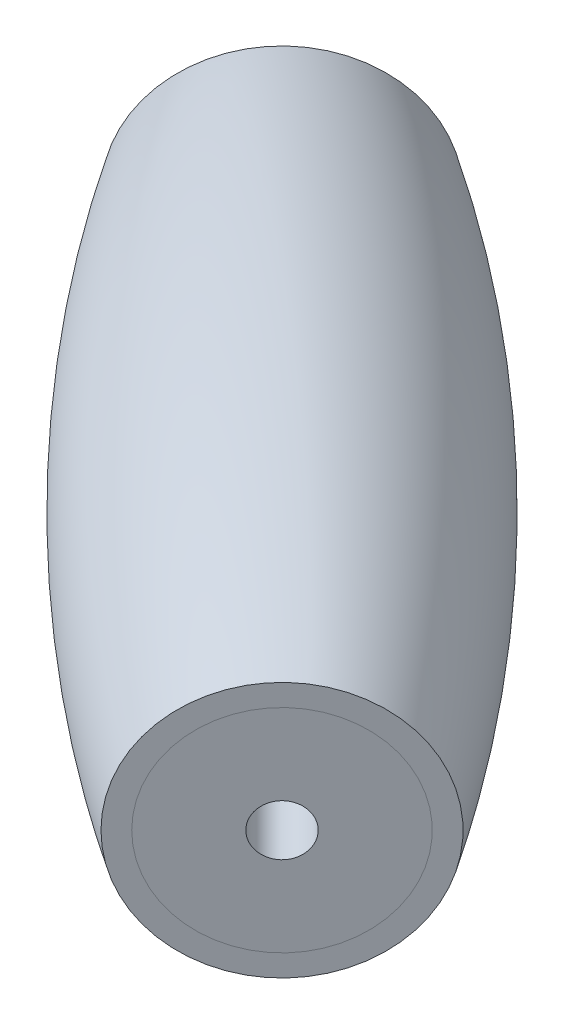
ISO-10303-21;
HEADER;
FILE_DESCRIPTION(('STEP AP214'),'2;1');
FILE_NAME('part.step','',(''),(''),'','','');
FILE_SCHEMA(('AUTOMOTIVE_DESIGN { 1 0 10303 214 1 1 1 1 }'));
ENDSEC;
DATA;
#1=APPLICATION_CONTEXT('core data for automotive mechanical design processes');
#2=APPLICATION_PROTOCOL_DEFINITION('international standard','automotive_design',2000,#1);
#3=PRODUCT_CONTEXT('',#1,'mechanical');
#4=PRODUCT('Part','Part','',(#3));
#5=PRODUCT_RELATED_PRODUCT_CATEGORY('part','',(#4));
#6=PRODUCT_DEFINITION_FORMATION('','',#4);
#7=PRODUCT_DEFINITION_CONTEXT('part definition',#1,'design');
#8=PRODUCT_DEFINITION('design','',#6,#7);
#9=PRODUCT_DEFINITION_SHAPE('','',#8);
#10=(LENGTH_UNIT() NAMED_UNIT(*) SI_UNIT(.MILLI.,.METRE.));
#11=(NAMED_UNIT(*) PLANE_ANGLE_UNIT() SI_UNIT($,.RADIAN.));
#12=(NAMED_UNIT(*) SI_UNIT($,.STERADIAN.) SOLID_ANGLE_UNIT());
#13=UNCERTAINTY_MEASURE_WITH_UNIT(LENGTH_MEASURE(1.E-05),#10,'distance_accuracy_value','');
#14=(GEOMETRIC_REPRESENTATION_CONTEXT(3) GLOBAL_UNCERTAINTY_ASSIGNED_CONTEXT((#13)) GLOBAL_UNIT_ASSIGNED_CONTEXT((#10,
#11,#12)) REPRESENTATION_CONTEXT('',''));
#15=CARTESIAN_POINT('',(0.,0.,0.));
#16=DIRECTION('',(0.,0.,1.));
#17=DIRECTION('',(1.,0.,0.));
#18=AXIS2_PLACEMENT_3D('',#15,#16,#17);
#19=CARTESIAN_POINT('',(0.,21.1042452771327,0.));
#20=DIRECTION('',(-0.707106781186546,0.,-0.707106781186549));
#21=DIRECTION('',(-0.707106781186549,0.,0.707106781186546));
#22=AXIS2_PLACEMENT_3D('',#19,#20,#21);
#23=DEGENERATE_TOROIDAL_SURFACE('',#22,43.1042452771327,46.5,.F.);
#24=CARTESIAN_POINT('',(6.4574982549739,21.1042452771328,6.45749825497393));
#25=DIRECTION('',(-0.707106781186546,0.,-0.707106781186549));
#26=DIRECTION('',(-0.707106781186549,0.,0.707106781186546));
#27=AXIS2_PLACEMENT_3D('',#24,#25,#26);
#28=CIRCLE('',#27,2.49017798464365);
#29=CARTESIAN_POINT('',(4.69667651567093,21.1042452771328,8.2183199942769));
#30=VERTEX_POINT('',#29);
#31=EDGE_CURVE('E11',#30,#30,#28,.T.);
#32=ORIENTED_EDGE('',*,*,#31,.F.);
#33=EDGE_LOOP('',(#32));
#34=FACE_BOUND('',#33,.T.);
#35=CARTESIAN_POINT('',(-6.45749825497391,21.1042452771327,-6.45749825497393));
#36=DIRECTION('',(-0.707106781186546,0.,-0.707106781186549));
#37=DIRECTION('',(-0.707106781186549,0.,0.707106781186546));
#38=AXIS2_PLACEMENT_3D('',#35,#36,#37);
#39=CIRCLE('',#38,2.49017798464364);
#40=CARTESIAN_POINT('',(-8.21831999427688,21.1042452771327,-4.69667651567096));
#41=VERTEX_POINT('',#40);
#42=EDGE_CURVE('E52',#41,#41,#39,.T.);
#43=ORIENTED_EDGE('',*,*,#42,.T.);
#44=EDGE_LOOP('',(#43));
#45=FACE_BOUND('',#44,.T.);
#46=ADVANCED_FACE('F38',(#34,#45),#23,.T.);
#47=CARTESIAN_POINT('',(6.4574982549739,23.5944232617764,6.45749825497392));
#48=DIRECTION('',(-0.707106781186546,0.,-0.707106781186549));
#49=DIRECTION('',(-0.707106781186549,0.,0.707106781186546));
#50=AXIS2_PLACEMENT_3D('',#47,#48,#49);
#51=PLANE('',#50);
#52=CARTESIAN_POINT('',(6.45749825497388,21.1042452771328,6.45749825497391));
#53=DIRECTION('',(-0.707106781186546,0.,-0.707106781186549));
#54=DIRECTION('',(-0.707106781186549,0.,0.707106781186546));
#55=AXIS2_PLACEMENT_3D('',#52,#53,#54);
#56=CIRCLE('',#55,3.);
#57=CARTESIAN_POINT('',(4.33617791141424,21.1042452771328,8.57881859853355));
#58=VERTEX_POINT('',#57);
#59=EDGE_CURVE('E44',#58,#58,#56,.T.);
#60=ORIENTED_EDGE('',*,*,#59,.F.);
#61=EDGE_LOOP('',(#60));
#62=FACE_BOUND('',#61,.T.);
#63=ORIENTED_EDGE('',*,*,#31,.T.);
#64=EDGE_LOOP('',(#63));
#65=FACE_BOUND('',#64,.T.);
#66=ADVANCED_FACE('F67',(#62,#65),#51,.F.);
#67=CARTESIAN_POINT('',(0.,21.1042452771327,0.));
#68=DIRECTION('',(-0.707106781186546,0.,-0.707106781186549));
#69=DIRECTION('',(-0.707106781186549,0.,0.707106781186546));
#70=AXIS2_PLACEMENT_3D('',#67,#68,#69);
#71=DEGENERATE_TOROIDAL_SURFACE('',#70,43.1042452771327,47.,.F.);
#72=CARTESIAN_POINT('',(-6.45749825497389,21.1042452771327,-6.45749825497392));
#73=DIRECTION('',(-0.707106781186546,0.,-0.707106781186549));
#74=DIRECTION('',(-0.707106781186549,0.,0.707106781186546));
#75=AXIS2_PLACEMENT_3D('',#72,#73,#74);
#76=CIRCLE('',#75,2.99999999999999);
#77=CARTESIAN_POINT('',(-8.57881859853354,21.1042452771327,-4.33617791141428));
#78=VERTEX_POINT('',#77);
#79=EDGE_CURVE('E48',#78,#78,#76,.T.);
#80=ORIENTED_EDGE('',*,*,#79,.F.);
#81=EDGE_LOOP('',(#80));
#82=FACE_BOUND('',#81,.T.);
#83=ORIENTED_EDGE('',*,*,#59,.T.);
#84=EDGE_LOOP('',(#83));
#85=FACE_BOUND('',#84,.T.);
#86=ADVANCED_FACE('F62',(#82,#85),#71,.F.);
#87=CARTESIAN_POINT('',(-6.4574982549739,24.1042452771327,-6.45749825497392));
#88=DIRECTION('',(0.707106781186546,0.,0.707106781186549));
#89=DIRECTION('',(0.707106781186549,0.,-0.707106781186546));
#90=AXIS2_PLACEMENT_3D('',#87,#88,#89);
#91=PLANE('',#90);
#92=ORIENTED_EDGE('',*,*,#42,.F.);
#93=EDGE_LOOP('',(#92));
#94=FACE_BOUND('',#93,.T.);
#95=ORIENTED_EDGE('',*,*,#79,.T.);
#96=EDGE_LOOP('',(#95));
#97=FACE_BOUND('',#96,.T.);
#98=ADVANCED_FACE('F59',(#94,#97),#91,.F.);
#99=CLOSED_SHELL('',(#46,#66,#86,#98));
#100=MANIFOLD_SOLID_BREP('B2',#99);
#101=CARTESIAN_POINT('',(6.4574982549739,23.5944232617764,6.45749825497392));
#102=DIRECTION('',(-0.707106781186546,0.,-0.707106781186549));
#103=DIRECTION('',(-0.707106781186549,0.,0.707106781186546));
#104=AXIS2_PLACEMENT_3D('',#101,#102,#103);
#105=PLANE('',#104);
#106=CARTESIAN_POINT('',(6.4574982549739,21.1042452771328,6.45749825497392));
#107=DIRECTION('',(0.707106781186546,0.,0.707106781186549));
#108=DIRECTION('',(0.707106781186549,0.,-0.707106781186546));
#109=AXIS2_PLACEMENT_3D('',#106,#107,#108);
#110=CIRCLE('',#109,0.6);
#111=CARTESIAN_POINT('',(6.88176232368583,21.1042452771328,6.033234186262));
#112=VERTEX_POINT('',#111);
#113=EDGE_CURVE('E112',#112,#112,#110,.T.);
#114=ORIENTED_EDGE('',*,*,#113,.F.);
#115=EDGE_LOOP('',(#114));
#116=FACE_BOUND('',#115,.T.);
#117=CARTESIAN_POINT('',(6.4574982549739,21.1042452771328,6.45749825497392));
#118=DIRECTION('',(-0.707106781186546,0.,-0.707106781186549));
#119=DIRECTION('',(-0.707106781186549,0.,0.707106781186546));
#120=AXIS2_PLACEMENT_3D('',#117,#118,#119);
#121=CIRCLE('',#120,2.49017798464365);
#122=CARTESIAN_POINT('',(4.69667651567091,21.1042452771328,8.2183199942769));
#123=VERTEX_POINT('',#122);
#124=EDGE_CURVE('E37',#123,#123,#121,.T.);
#125=ORIENTED_EDGE('',*,*,#124,.F.);
#126=EDGE_LOOP('',(#125));
#127=FACE_BOUND('',#126,.T.);
#128=ADVANCED_FACE('F99',(#116,#127),#105,.F.);
#129=CARTESIAN_POINT('',(0.,21.1042452771327,0.));
#130=DIRECTION('',(-0.707106781186546,0.,-0.707106781186549));
#131=DIRECTION('',(-0.707106781186549,0.,0.707106781186546));
#132=AXIS2_PLACEMENT_3D('',#129,#130,#131);
#133=DEGENERATE_TOROIDAL_SURFACE('',#132,43.1042452771327,46.5,.F.);
#134=CARTESIAN_POINT('',(-6.45749825497389,21.1042452771327,-6.45749825497391));
#135=DIRECTION('',(-0.707106781186546,0.,-0.707106781186549));
#136=DIRECTION('',(-0.707106781186549,0.,0.707106781186546));
#137=AXIS2_PLACEMENT_3D('',#134,#135,#136);
#138=CIRCLE('',#137,2.49017798464365);
#139=CARTESIAN_POINT('',(-8.21831999427687,21.1042452771327,-4.69667651567094));
#140=VERTEX_POINT('',#139);
#141=EDGE_CURVE('E106',#140,#140,#138,.T.);
#142=ORIENTED_EDGE('',*,*,#141,.F.);
#143=EDGE_LOOP('',(#142));
#144=FACE_BOUND('',#143,.T.);
#145=ORIENTED_EDGE('',*,*,#124,.T.);
#146=EDGE_LOOP('',(#145));
#147=FACE_BOUND('',#146,.T.);
#148=ADVANCED_FACE('F128',(#144,#147),#133,.F.);
#149=CARTESIAN_POINT('',(-6.45749825497389,23.5944232617764,-6.45749825497391));
#150=DIRECTION('',(0.707106781186546,0.,0.707106781186549));
#151=DIRECTION('',(0.707106781186549,0.,-0.707106781186546));
#152=AXIS2_PLACEMENT_3D('',#149,#150,#151);
#153=PLANE('',#152);
#154=CARTESIAN_POINT('',(-6.45749825497389,21.1042452771327,-6.45749825497391));
#155=DIRECTION('',(0.707106781186546,0.,0.707106781186549));
#156=DIRECTION('',(0.707106781186549,0.,-0.707106781186546));
#157=AXIS2_PLACEMENT_3D('',#154,#155,#156);
#158=CIRCLE('',#157,0.6);
#159=CARTESIAN_POINT('',(-6.03323418626196,21.1042452771327,-6.88176232368583));
#160=VERTEX_POINT('',#159);
#161=EDGE_CURVE('E102',#160,#160,#158,.T.);
#162=ORIENTED_EDGE('',*,*,#161,.T.);
#163=EDGE_LOOP('',(#162));
#164=FACE_BOUND('',#163,.T.);
#165=ORIENTED_EDGE('',*,*,#141,.T.);
#166=EDGE_LOOP('',(#165));
#167=FACE_BOUND('',#166,.T.);
#168=ADVANCED_FACE('F119',(#164,#167),#153,.F.);
#169=CARTESIAN_POINT('',(-8.21831999427686,21.1042452771327,-8.21831999427689));
#170=DIRECTION('',(0.707106781186546,0.,0.707106781186549));
#171=DIRECTION('',(0.707106781186549,0.,-0.707106781186546));
#172=AXIS2_PLACEMENT_3D('',#169,#170,#171);
#173=CYLINDRICAL_SURFACE('',#172,0.6);
#174=ORIENTED_EDGE('',*,*,#113,.T.);
#175=EDGE_LOOP('',(#174));
#176=FACE_BOUND('',#175,.T.);
#177=ORIENTED_EDGE('',*,*,#161,.F.);
#178=EDGE_LOOP('',(#177));
#179=FACE_BOUND('',#178,.T.);
#180=ADVANCED_FACE('F122',(#176,#179),#173,.F.);
#181=CLOSED_SHELL('',(#128,#148,#168,#180));
#182=MANIFOLD_SOLID_BREP('B6',#181);
#183=ADVANCED_BREP_SHAPE_REPRESENTATION('',(#18,#100,#182),#14);
#184=SHAPE_DEFINITION_REPRESENTATION(#9,#183);
ENDSEC;
END-ISO-10303-21;
